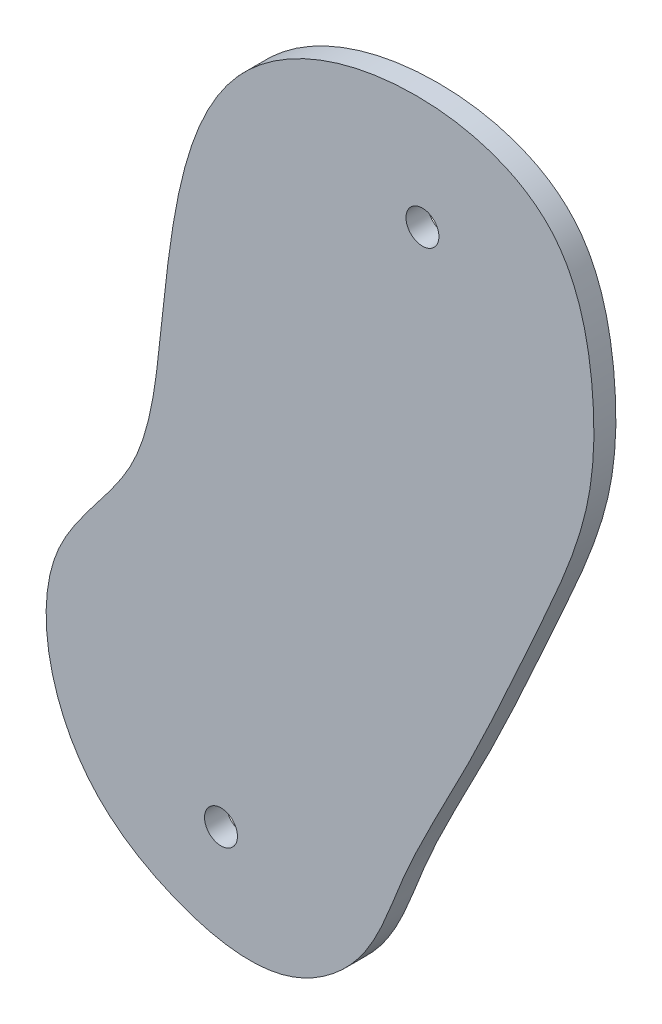
ISO-10303-21;
HEADER;
FILE_DESCRIPTION(('STEP AP214'),'2;1');
FILE_NAME('part.step','',(''),(''),'','','');
FILE_SCHEMA(('AUTOMOTIVE_DESIGN { 1 0 10303 214 1 1 1 1 }'));
ENDSEC;
DATA;
#1=APPLICATION_CONTEXT('core data for automotive mechanical design processes');
#2=APPLICATION_PROTOCOL_DEFINITION('international standard','automotive_design',2000,#1);
#3=PRODUCT_CONTEXT('',#1,'mechanical');
#4=PRODUCT('Part','Part','',(#3));
#5=PRODUCT_RELATED_PRODUCT_CATEGORY('part','',(#4));
#6=PRODUCT_DEFINITION_FORMATION('','',#4);
#7=PRODUCT_DEFINITION_CONTEXT('part definition',#1,'design');
#8=PRODUCT_DEFINITION('design','',#6,#7);
#9=PRODUCT_DEFINITION_SHAPE('','',#8);
#10=(LENGTH_UNIT() NAMED_UNIT(*) SI_UNIT(.MILLI.,.METRE.));
#11=(NAMED_UNIT(*) PLANE_ANGLE_UNIT() SI_UNIT($,.RADIAN.));
#12=(NAMED_UNIT(*) SI_UNIT($,.STERADIAN.) SOLID_ANGLE_UNIT());
#13=UNCERTAINTY_MEASURE_WITH_UNIT(LENGTH_MEASURE(1.E-05),#10,'distance_accuracy_value','');
#14=(GEOMETRIC_REPRESENTATION_CONTEXT(3) GLOBAL_UNCERTAINTY_ASSIGNED_CONTEXT((#13)) GLOBAL_UNIT_ASSIGNED_CONTEXT((#10,
#11,#12)) REPRESENTATION_CONTEXT('',''));
#15=CARTESIAN_POINT('',(0.,0.,0.));
#16=DIRECTION('',(0.,0.,1.));
#17=DIRECTION('',(1.,0.,0.));
#18=AXIS2_PLACEMENT_3D('',#15,#16,#17);
#19=CARTESIAN_POINT('',(485.54482301307,246.846912927765,3.73351125079033));
#20=DIRECTION('',(0.,0.,-1.));
#21=DIRECTION('',(-1.,0.,0.));
#22=AXIS2_PLACEMENT_3D('',#19,#20,#21);
#23=PLANE('',#22);
#24=CARTESIAN_POINT('',(487.596037745759,158.3391863239,3.73351125079033));
#25=DIRECTION('',(0.,0.,1.));
#26=DIRECTION('',(1.,0.,0.));
#27=AXIS2_PLACEMENT_3D('',#24,#25,#26);
#28=CIRCLE('',#27,2.38125);
#29=CARTESIAN_POINT('',(489.977287745758,158.3391863239,3.73351125079033));
#30=VERTEX_POINT('',#29);
#31=EDGE_CURVE('E60',#30,#30,#28,.T.);
#32=ORIENTED_EDGE('',*,*,#31,.F.);
#33=EDGE_LOOP('',(#32));
#34=FACE_BOUND('',#33,.T.);
#35=CARTESIAN_POINT('',(516.718792339194,247.991587719377,3.73351125079033));
#36=DIRECTION('',(0.,0.,1.));
#37=DIRECTION('',(1.,0.,0.));
#38=AXIS2_PLACEMENT_3D('',#35,#36,#37);
#39=CIRCLE('',#38,2.38124999999995);
#40=CARTESIAN_POINT('',(519.100042339194,247.991587719377,3.73351125079033));
#41=VERTEX_POINT('',#40);
#42=EDGE_CURVE('E51',#41,#41,#39,.T.);
#43=ORIENTED_EDGE('',*,*,#42,.F.);
#44=EDGE_LOOP('',(#43));
#45=FACE_BOUND('',#44,.T.);
#46=CARTESIAN_POINT('',(513.863620320229,164.906081967518,3.73351125079033));
#47=CARTESIAN_POINT('',(516.275019113407,170.706206291992,3.73351125079033));
#48=CARTESIAN_POINT('',(523.710966038038,184.090511890324,3.73351125079033));
#49=CARTESIAN_POINT('',(532.635570546478,204.346670633689,3.73351125079033));
#50=CARTESIAN_POINT('',(541.371224714736,223.5703710597,3.73351125079033));
#51=CARTESIAN_POINT('',(541.872372663464,240.888856424604,3.73351125079033));
#52=CARTESIAN_POINT('',(536.899366844666,262.877301629262,3.73351125079033));
#53=CARTESIAN_POINT('',(509.107824132844,266.463883034808,3.73351125079033));
#54=CARTESIAN_POINT('',(481.929208861613,251.182544029444,3.73351125079033));
#55=CARTESIAN_POINT('',(479.806726881191,222.028954164352,3.73351125079033));
#56=CARTESIAN_POINT('',(476.458481992694,195.713316659121,3.73351125079033));
#57=CARTESIAN_POINT('',(461.931198559841,182.93878868321,3.73351125079033));
#58=CARTESIAN_POINT('',(461.86478035606,165.467493058,3.73351125079033));
#59=CARTESIAN_POINT('',(468.652219903466,152.94697262903,3.73351125079033));
#60=CARTESIAN_POINT('',(480.708013786986,145.171598934597,3.73351125079033));
#61=CARTESIAN_POINT('',(496.073073033502,141.716700479801,3.73351125079033));
#62=CARTESIAN_POINT('',(509.216660203211,151.717295943953,3.73351125079033));
#63=CARTESIAN_POINT('',(512.075316728478,160.604685122082,3.73351125079033));
#64=CARTESIAN_POINT('',(513.863620320229,164.906081967518,3.73351125079033));
#65=B_SPLINE_CURVE_WITH_KNOTS('',3,(#46,#47,#48,#49,#50,#51,#52,#53,#54,#55,#56,#57,#58,#59,#60,
#61,#62,#63,#64),.UNSPECIFIED.,.T.,.F.,(4,1,1,1,1,1,1,1,1,1,1,1,1,1,1,1,4),(0.,
0.0603668139556772,0.147459281897086,0.214848287586456,0.259879476598933,0.315050301174277,
0.412854640574134,0.470827473209762,0.603018855395841,0.661592158924291,0.72322373467798,
0.77467791900714,0.816596322263461,0.855564736249024,0.91114666414,0.955231714254426,1.),.UNSPECIFIED.);
#66=CARTESIAN_POINT('',(513.863620320229,164.906081967518,3.73351125079033));
#67=VERTEX_POINT('',#66);
#68=EDGE_CURVE('E10',#67,#67,#65,.T.);
#69=ORIENTED_EDGE('',*,*,#68,.T.);
#70=EDGE_LOOP('',(#69));
#71=FACE_BOUND('',#70,.T.);
#72=ADVANCED_FACE('F33',(#34,#45,#71),#23,.F.);
#73=CARTESIAN_POINT('',(485.54482301307,246.846912927765,0.558511251148242));
#74=DIRECTION('',(0.,0.,-1.));
#75=DIRECTION('',(-1.,0.,0.));
#76=AXIS2_PLACEMENT_3D('',#73,#74,#75);
#77=PLANE('',#76);
#78=CARTESIAN_POINT('',(487.596037745759,158.3391863239,0.558511251148242));
#79=DIRECTION('',(0.,0.,1.));
#80=DIRECTION('',(1.,0.,0.));
#81=AXIS2_PLACEMENT_3D('',#78,#79,#80);
#82=CIRCLE('',#81,2.38125);
#83=CARTESIAN_POINT('',(489.977287745758,158.3391863239,0.558511251148242));
#84=VERTEX_POINT('',#83);
#85=EDGE_CURVE('E57',#84,#84,#82,.T.);
#86=ORIENTED_EDGE('',*,*,#85,.T.);
#87=EDGE_LOOP('',(#86));
#88=FACE_BOUND('',#87,.T.);
#89=CARTESIAN_POINT('',(516.718792339194,247.991587719377,0.558511251148242));
#90=DIRECTION('',(0.,0.,1.));
#91=DIRECTION('',(1.,0.,0.));
#92=AXIS2_PLACEMENT_3D('',#89,#90,#91);
#93=CIRCLE('',#92,2.38124999999995);
#94=CARTESIAN_POINT('',(519.100042339194,247.991587719377,0.558511251148242));
#95=VERTEX_POINT('',#94);
#96=EDGE_CURVE('E46',#95,#95,#93,.T.);
#97=ORIENTED_EDGE('',*,*,#96,.T.);
#98=EDGE_LOOP('',(#97));
#99=FACE_BOUND('',#98,.T.);
#100=CARTESIAN_POINT('',(513.863620320229,164.906081967518,0.558511251148242));
#101=CARTESIAN_POINT('',(516.275019113407,170.706206291992,0.558511251148242));
#102=CARTESIAN_POINT('',(523.710966038038,184.090511890324,0.558511251148242));
#103=CARTESIAN_POINT('',(532.635570546478,204.346670633689,0.558511251148242));
#104=CARTESIAN_POINT('',(541.371224714736,223.5703710597,0.558511251148242));
#105=CARTESIAN_POINT('',(541.872372663464,240.888856424604,0.558511251148242));
#106=CARTESIAN_POINT('',(536.899366844666,262.877301629262,0.558511251148242));
#107=CARTESIAN_POINT('',(509.107824132844,266.463883034808,0.558511251148242));
#108=CARTESIAN_POINT('',(481.929208861613,251.182544029444,0.558511251148242));
#109=CARTESIAN_POINT('',(479.806726881191,222.028954164352,0.558511251148242));
#110=CARTESIAN_POINT('',(476.458481992694,195.713316659121,0.558511251148242));
#111=CARTESIAN_POINT('',(461.931198559841,182.93878868321,0.558511251148242));
#112=CARTESIAN_POINT('',(461.86478035606,165.467493058,0.558511251148242));
#113=CARTESIAN_POINT('',(468.652219903466,152.94697262903,0.558511251148242));
#114=CARTESIAN_POINT('',(480.708013786986,145.171598934597,0.558511251148242));
#115=CARTESIAN_POINT('',(496.073073033502,141.716700479801,0.558511251148242));
#116=CARTESIAN_POINT('',(509.216660203211,151.717295943953,0.558511251148242));
#117=CARTESIAN_POINT('',(512.075316728478,160.604685122082,0.558511251148242));
#118=CARTESIAN_POINT('',(513.863620320229,164.906081967518,0.558511251148242));
#119=B_SPLINE_CURVE_WITH_KNOTS('',3,(#100,#101,#102,#103,#104,#105,#106,#107,#108,#109,#110,
#111,#112,#113,#114,#115,#116,#117,#118),.UNSPECIFIED.,.T.,.F.,(4,1,1,1,1,1,1,1,1,1,1,1,1,1,1,1,
4),(0.,0.0603668139556772,0.147459281897086,0.214848287586456,0.259879476598933,
0.315050301174277,0.412854640574134,0.470827473209762,0.603018855395841,0.661592158924291,
0.72322373467798,0.77467791900714,0.816596322263461,0.855564736249024,0.91114666414,
0.955231714254426,1.),.UNSPECIFIED.);
#120=CARTESIAN_POINT('',(513.863620320229,164.906081967518,0.558511251148242));
#121=VERTEX_POINT('',#120);
#122=EDGE_CURVE('E38',#121,#121,#119,.T.);
#123=ORIENTED_EDGE('',*,*,#122,.F.);
#124=EDGE_LOOP('',(#123));
#125=FACE_BOUND('',#124,.T.);
#126=ADVANCED_FACE('F66',(#88,#99,#125),#77,.T.);
#127=DIRECTION('',(0.,0.,-1.));
#128=VECTOR('',#127,1.);
#129=SURFACE_OF_LINEAR_EXTRUSION('',#65,#128);
#130=ORIENTED_EDGE('',*,*,#68,.F.);
#131=EDGE_LOOP('',(#130));
#132=FACE_BOUND('',#131,.T.);
#133=ORIENTED_EDGE('',*,*,#122,.T.);
#134=EDGE_LOOP('',(#133));
#135=FACE_BOUND('',#134,.T.);
#136=ADVANCED_FACE('F35',(#132,#135),#129,.F.);
#137=CARTESIAN_POINT('',(516.718792339194,247.991587719377,0.558511251148242));
#138=DIRECTION('',(0.,0.,1.));
#139=DIRECTION('',(1.,0.,0.));
#140=AXIS2_PLACEMENT_3D('',#137,#138,#139);
#141=CYLINDRICAL_SURFACE('',#140,2.38124999999995);
#142=CARTESIAN_POINT('',(519.100042339194,247.991587719377,0.558511251148242));
#143=CARTESIAN_POINT('',(519.100042339194,247.991587719377,0.59158416781118));
#144=CARTESIAN_POINT('',(519.100042339194,247.991587719377,0.624657084474119));
#145=CARTESIAN_POINT('',(519.100042339194,247.991587719377,0.690802917799995));
#146=CARTESIAN_POINT('',(519.100042339194,247.991587719377,0.723875834462934));
#147=CARTESIAN_POINT('',(519.100042339194,247.991587719377,0.790021667788811));
#148=CARTESIAN_POINT('',(519.100042339194,247.991587719377,0.823094584451749));
#149=CARTESIAN_POINT('',(519.100042339194,247.991587719377,0.889240417777626));
#150=CARTESIAN_POINT('',(519.100042339194,247.991587719377,0.922313334440565));
#151=CARTESIAN_POINT('',(519.100042339194,247.991587719377,0.988459167766441));
#152=CARTESIAN_POINT('',(519.100042339194,247.991587719377,1.02153208442938));
#153=CARTESIAN_POINT('',(519.100042339194,247.991587719377,1.08767791775526));
#154=CARTESIAN_POINT('',(519.100042339194,247.991587719377,1.1207508344182));
#155=CARTESIAN_POINT('',(519.100042339194,247.991587719377,1.18689666774407));
#156=CARTESIAN_POINT('',(519.100042339194,247.991587719377,1.21996958440701));
#157=CARTESIAN_POINT('',(519.100042339194,247.991587719377,1.28611541773289));
#158=CARTESIAN_POINT('',(519.100042339194,247.991587719377,1.31918833439583));
#159=CARTESIAN_POINT('',(519.100042339194,247.991587719377,1.3853341677217));
#160=CARTESIAN_POINT('',(519.100042339194,247.991587719377,1.41840708438464));
#161=CARTESIAN_POINT('',(519.100042339194,247.991587719377,1.48455291771052));
#162=CARTESIAN_POINT('',(519.100042339194,247.991587719377,1.51762583437346));
#163=CARTESIAN_POINT('',(519.100042339194,247.991587719377,1.58377166769933));
#164=CARTESIAN_POINT('',(519.100042339194,247.991587719377,1.61684458436227));
#165=CARTESIAN_POINT('',(519.100042339194,247.991587719377,1.68299041768815));
#166=CARTESIAN_POINT('',(519.100042339194,247.991587719377,1.71606333435109));
#167=CARTESIAN_POINT('',(519.100042339194,247.991587719377,1.78220916767696));
#168=CARTESIAN_POINT('',(519.100042339194,247.991587719377,1.8152820843399));
#169=CARTESIAN_POINT('',(519.100042339194,247.991587719377,1.88142791766578));
#170=CARTESIAN_POINT('',(519.100042339194,247.991587719377,1.91450083432872));
#171=CARTESIAN_POINT('',(519.100042339194,247.991587719377,1.98064666765459));
#172=CARTESIAN_POINT('',(519.100042339194,247.991587719377,2.01371958431753));
#173=CARTESIAN_POINT('',(519.100042339194,247.991587719377,2.07986541764341));
#174=CARTESIAN_POINT('',(519.100042339194,247.991587719377,2.11293833430635));
#175=CARTESIAN_POINT('',(519.100042339194,247.991587719377,2.17908416763223));
#176=CARTESIAN_POINT('',(519.100042339194,247.991587719377,2.21215708429516));
#177=CARTESIAN_POINT('',(519.100042339194,247.991587719377,2.27830291762104));
#178=CARTESIAN_POINT('',(519.100042339194,247.991587719377,2.31137583428398));
#179=CARTESIAN_POINT('',(519.100042339194,247.991587719377,2.37752166760986));
#180=CARTESIAN_POINT('',(519.100042339194,247.991587719377,2.41059458427279));
#181=CARTESIAN_POINT('',(519.100042339194,247.991587719377,2.47674041759867));
#182=CARTESIAN_POINT('',(519.100042339194,247.991587719377,2.50981333426161));
#183=CARTESIAN_POINT('',(519.100042339194,247.991587719377,2.57595916758749));
#184=CARTESIAN_POINT('',(519.100042339194,247.991587719377,2.60903208425042));
#185=CARTESIAN_POINT('',(519.100042339194,247.991587719377,2.6751779175763));
#186=CARTESIAN_POINT('',(519.100042339194,247.991587719377,2.70825083423924));
#187=CARTESIAN_POINT('',(519.100042339194,247.991587719377,2.77439666756512));
#188=CARTESIAN_POINT('',(519.100042339194,247.991587719377,2.80746958422806));
#189=CARTESIAN_POINT('',(519.100042339194,247.991587719377,2.87361541755393));
#190=CARTESIAN_POINT('',(519.100042339194,247.991587719377,2.90668833421687));
#191=CARTESIAN_POINT('',(519.100042339194,247.991587719377,2.97283416754275));
#192=CARTESIAN_POINT('',(519.100042339194,247.991587719377,3.00590708420569));
#193=CARTESIAN_POINT('',(519.100042339194,247.991587719377,3.07205291753156));
#194=CARTESIAN_POINT('',(519.100042339194,247.991587719377,3.1051258341945));
#195=CARTESIAN_POINT('',(519.100042339194,247.991587719377,3.17127166752038));
#196=CARTESIAN_POINT('',(519.100042339194,247.991587719377,3.20434458418332));
#197=CARTESIAN_POINT('',(519.100042339194,247.991587719377,3.27049041750919));
#198=CARTESIAN_POINT('',(519.100042339194,247.991587719377,3.30356333417213));
#199=CARTESIAN_POINT('',(519.100042339194,247.991587719377,3.36970916749801));
#200=CARTESIAN_POINT('',(519.100042339194,247.991587719377,3.40278208416095));
#201=CARTESIAN_POINT('',(519.100042339194,247.991587719377,3.46892791748683));
#202=CARTESIAN_POINT('',(519.100042339194,247.991587719377,3.50200083414976));
#203=CARTESIAN_POINT('',(519.100042339194,247.991587719377,3.56814666747564));
#204=CARTESIAN_POINT('',(519.100042339194,247.991587719377,3.60121958413858));
#205=CARTESIAN_POINT('',(519.100042339194,247.991587719377,3.66736541746446));
#206=CARTESIAN_POINT('',(519.100042339194,247.991587719377,3.70043833412739));
#207=CARTESIAN_POINT('',(519.100042339194,247.991587719377,3.73351125079033));
#208=B_SPLINE_CURVE_WITH_KNOTS('',3,(#142,#143,#144,#145,#146,#147,#148,#149,#150,#151,#152,
#153,#154,#155,#156,#157,#158,#159,#160,#161,#162,#163,#164,#165,#166,#167,#168,#169,#170,#171,
#172,#173,#174,#175,#176,#177,#178,#179,#180,#181,#182,#183,#184,#185,#186,#187,#188,#189,#190,
#191,#192,#193,#194,#195,#196,#197,#198,#199,#200,#201,#202,#203,#204,#205,#206,#207),
.UNSPECIFIED.,.F.,.F.,(4,2,2,2,2,2,2,2,2,2,2,2,2,2,2,2,2,2,2,2,2,2,2,2,2,2,2,2,2,2,2,2,4),(0.,
0.0992187499888153,0.198437499977631,0.297656249966446,0.396874999955261,0.496093749944076,
0.595312499932892,0.694531249921707,0.793749999910523,0.892968749899338,0.992187499888153,
1.09140624987697,1.19062499986578,1.2898437498546,1.38906249984341,1.48828124983223,
1.58749999982105,1.68671874980986,1.78593749979868,1.88515624978749,1.98437499977631,
2.08359374976512,2.18281249975394,2.28203124974275,2.38124999973157,2.48046874972038,
2.5796874997092,2.67890624969801,2.77812499968683,2.87734374967564,2.97656249966446,
3.07578124965328,3.17499999964209),.UNSPECIFIED.);
#209=EDGE_CURVE('BSEAM72',#95,#41,#208,.T.);
#210=ORIENTED_EDGE('',*,*,#96,.F.);
#211=ORIENTED_EDGE('',*,*,#42,.T.);
#212=ORIENTED_EDGE('',*,*,#209,.T.);
#213=ORIENTED_EDGE('',*,*,#209,.F.);
#214=EDGE_LOOP('',(#210,#212,#211,#213));
#215=FACE_BOUND('',#214,.T.);
#216=ADVANCED_FACE('F72',(#215),#141,.F.);
#217=CARTESIAN_POINT('',(487.596037745759,158.3391863239,0.558511251148242));
#218=DIRECTION('',(0.,0.,1.));
#219=DIRECTION('',(1.,0.,0.));
#220=AXIS2_PLACEMENT_3D('',#217,#218,#219);
#221=CYLINDRICAL_SURFACE('',#220,2.38125);
#222=CARTESIAN_POINT('',(489.977287745758,158.3391863239,0.558511251148242));
#223=CARTESIAN_POINT('',(489.977287745758,158.3391863239,0.59158416781118));
#224=CARTESIAN_POINT('',(489.977287745758,158.3391863239,0.624657084474119));
#225=CARTESIAN_POINT('',(489.977287745758,158.3391863239,0.690802917799995));
#226=CARTESIAN_POINT('',(489.977287745758,158.3391863239,0.723875834462934));
#227=CARTESIAN_POINT('',(489.977287745758,158.3391863239,0.790021667788811));
#228=CARTESIAN_POINT('',(489.977287745758,158.3391863239,0.823094584451749));
#229=CARTESIAN_POINT('',(489.977287745758,158.3391863239,0.889240417777626));
#230=CARTESIAN_POINT('',(489.977287745758,158.3391863239,0.922313334440565));
#231=CARTESIAN_POINT('',(489.977287745758,158.3391863239,0.988459167766441));
#232=CARTESIAN_POINT('',(489.977287745758,158.3391863239,1.02153208442938));
#233=CARTESIAN_POINT('',(489.977287745758,158.3391863239,1.08767791775526));
#234=CARTESIAN_POINT('',(489.977287745758,158.3391863239,1.1207508344182));
#235=CARTESIAN_POINT('',(489.977287745758,158.3391863239,1.18689666774407));
#236=CARTESIAN_POINT('',(489.977287745758,158.3391863239,1.21996958440701));
#237=CARTESIAN_POINT('',(489.977287745758,158.3391863239,1.28611541773289));
#238=CARTESIAN_POINT('',(489.977287745758,158.3391863239,1.31918833439583));
#239=CARTESIAN_POINT('',(489.977287745758,158.3391863239,1.3853341677217));
#240=CARTESIAN_POINT('',(489.977287745758,158.3391863239,1.41840708438464));
#241=CARTESIAN_POINT('',(489.977287745758,158.3391863239,1.48455291771052));
#242=CARTESIAN_POINT('',(489.977287745758,158.3391863239,1.51762583437346));
#243=CARTESIAN_POINT('',(489.977287745758,158.3391863239,1.58377166769933));
#244=CARTESIAN_POINT('',(489.977287745758,158.3391863239,1.61684458436227));
#245=CARTESIAN_POINT('',(489.977287745758,158.3391863239,1.68299041768815));
#246=CARTESIAN_POINT('',(489.977287745758,158.3391863239,1.71606333435109));
#247=CARTESIAN_POINT('',(489.977287745758,158.3391863239,1.78220916767696));
#248=CARTESIAN_POINT('',(489.977287745758,158.3391863239,1.8152820843399));
#249=CARTESIAN_POINT('',(489.977287745758,158.3391863239,1.88142791766578));
#250=CARTESIAN_POINT('',(489.977287745758,158.3391863239,1.91450083432872));
#251=CARTESIAN_POINT('',(489.977287745758,158.3391863239,1.98064666765459));
#252=CARTESIAN_POINT('',(489.977287745758,158.3391863239,2.01371958431753));
#253=CARTESIAN_POINT('',(489.977287745758,158.3391863239,2.07986541764341));
#254=CARTESIAN_POINT('',(489.977287745758,158.3391863239,2.11293833430635));
#255=CARTESIAN_POINT('',(489.977287745758,158.3391863239,2.17908416763223));
#256=CARTESIAN_POINT('',(489.977287745758,158.3391863239,2.21215708429516));
#257=CARTESIAN_POINT('',(489.977287745758,158.3391863239,2.27830291762104));
#258=CARTESIAN_POINT('',(489.977287745758,158.3391863239,2.31137583428398));
#259=CARTESIAN_POINT('',(489.977287745758,158.3391863239,2.37752166760986));
#260=CARTESIAN_POINT('',(489.977287745758,158.3391863239,2.41059458427279));
#261=CARTESIAN_POINT('',(489.977287745758,158.3391863239,2.47674041759867));
#262=CARTESIAN_POINT('',(489.977287745758,158.3391863239,2.50981333426161));
#263=CARTESIAN_POINT('',(489.977287745758,158.3391863239,2.57595916758749));
#264=CARTESIAN_POINT('',(489.977287745758,158.3391863239,2.60903208425042));
#265=CARTESIAN_POINT('',(489.977287745758,158.3391863239,2.6751779175763));
#266=CARTESIAN_POINT('',(489.977287745758,158.3391863239,2.70825083423924));
#267=CARTESIAN_POINT('',(489.977287745758,158.3391863239,2.77439666756512));
#268=CARTESIAN_POINT('',(489.977287745758,158.3391863239,2.80746958422806));
#269=CARTESIAN_POINT('',(489.977287745758,158.3391863239,2.87361541755393));
#270=CARTESIAN_POINT('',(489.977287745758,158.3391863239,2.90668833421687));
#271=CARTESIAN_POINT('',(489.977287745758,158.3391863239,2.97283416754275));
#272=CARTESIAN_POINT('',(489.977287745758,158.3391863239,3.00590708420569));
#273=CARTESIAN_POINT('',(489.977287745758,158.3391863239,3.07205291753156));
#274=CARTESIAN_POINT('',(489.977287745758,158.3391863239,3.1051258341945));
#275=CARTESIAN_POINT('',(489.977287745758,158.3391863239,3.17127166752038));
#276=CARTESIAN_POINT('',(489.977287745758,158.3391863239,3.20434458418332));
#277=CARTESIAN_POINT('',(489.977287745758,158.3391863239,3.27049041750919));
#278=CARTESIAN_POINT('',(489.977287745758,158.3391863239,3.30356333417213));
#279=CARTESIAN_POINT('',(489.977287745758,158.3391863239,3.36970916749801));
#280=CARTESIAN_POINT('',(489.977287745758,158.3391863239,3.40278208416095));
#281=CARTESIAN_POINT('',(489.977287745758,158.3391863239,3.46892791748683));
#282=CARTESIAN_POINT('',(489.977287745758,158.3391863239,3.50200083414976));
#283=CARTESIAN_POINT('',(489.977287745758,158.3391863239,3.56814666747564));
#284=CARTESIAN_POINT('',(489.977287745758,158.3391863239,3.60121958413858));
#285=CARTESIAN_POINT('',(489.977287745758,158.3391863239,3.66736541746446));
#286=CARTESIAN_POINT('',(489.977287745758,158.3391863239,3.70043833412739));
#287=CARTESIAN_POINT('',(489.977287745758,158.3391863239,3.73351125079033));
#288=B_SPLINE_CURVE_WITH_KNOTS('',3,(#222,#223,#224,#225,#226,#227,#228,#229,#230,#231,#232,
#233,#234,#235,#236,#237,#238,#239,#240,#241,#242,#243,#244,#245,#246,#247,#248,#249,#250,#251,
#252,#253,#254,#255,#256,#257,#258,#259,#260,#261,#262,#263,#264,#265,#266,#267,#268,#269,#270,
#271,#272,#273,#274,#275,#276,#277,#278,#279,#280,#281,#282,#283,#284,#285,#286,#287),
.UNSPECIFIED.,.F.,.F.,(4,2,2,2,2,2,2,2,2,2,2,2,2,2,2,2,2,2,2,2,2,2,2,2,2,2,2,2,2,2,2,2,4),(0.,
0.0992187499888153,0.198437499977631,0.297656249966446,0.396874999955261,0.496093749944076,
0.595312499932892,0.694531249921707,0.793749999910523,0.892968749899338,0.992187499888153,
1.09140624987697,1.19062499986578,1.2898437498546,1.38906249984341,1.48828124983223,
1.58749999982105,1.68671874980986,1.78593749979868,1.88515624978749,1.98437499977631,
2.08359374976512,2.18281249975394,2.28203124974275,2.38124999973157,2.48046874972038,
2.5796874997092,2.67890624969801,2.77812499968683,2.87734374967564,2.97656249966446,
3.07578124965328,3.17499999964209),.UNSPECIFIED.);
#289=EDGE_CURVE('BSEAM69',#84,#30,#288,.T.);
#290=ORIENTED_EDGE('',*,*,#85,.F.);
#291=ORIENTED_EDGE('',*,*,#31,.T.);
#292=ORIENTED_EDGE('',*,*,#289,.T.);
#293=ORIENTED_EDGE('',*,*,#289,.F.);
#294=EDGE_LOOP('',(#290,#292,#291,#293));
#295=FACE_BOUND('',#294,.T.);
#296=ADVANCED_FACE('F69',(#295),#221,.F.);
#297=CLOSED_SHELL('',(#72,#126,#136,#216,#296));
#298=MANIFOLD_SOLID_BREP('B2',#297);
#299=ADVANCED_BREP_SHAPE_REPRESENTATION('',(#18,#298),#14);
#300=SHAPE_DEFINITION_REPRESENTATION(#9,#299);
ENDSEC;
END-ISO-10303-21;
